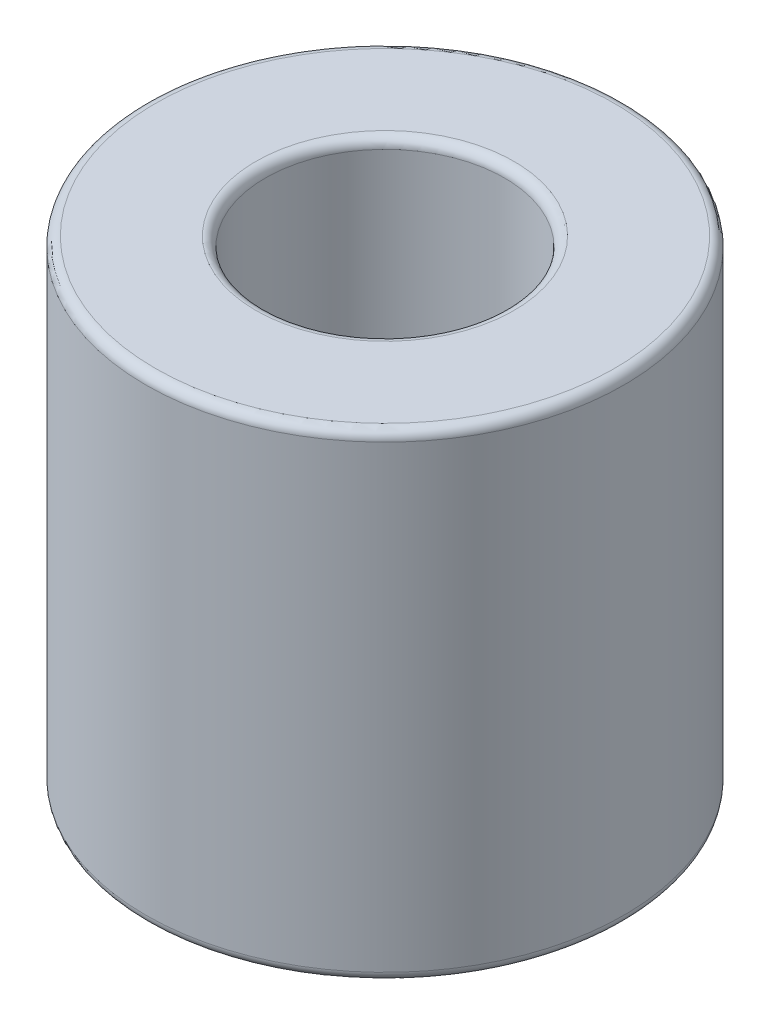
ISO-10303-21;
HEADER;
FILE_DESCRIPTION(('STEP AP214'),'2;1');
FILE_NAME('part.step','',(''),(''),'','','');
FILE_SCHEMA(('AUTOMOTIVE_DESIGN { 1 0 10303 214 1 1 1 1 }'));
ENDSEC;
DATA;
#1=APPLICATION_CONTEXT('core data for automotive mechanical design processes');
#2=APPLICATION_PROTOCOL_DEFINITION('international standard','automotive_design',2000,#1);
#3=PRODUCT_CONTEXT('',#1,'mechanical');
#4=PRODUCT('Part','Part','',(#3));
#5=PRODUCT_RELATED_PRODUCT_CATEGORY('part','',(#4));
#6=PRODUCT_DEFINITION_FORMATION('','',#4);
#7=PRODUCT_DEFINITION_CONTEXT('part definition',#1,'design');
#8=PRODUCT_DEFINITION('design','',#6,#7);
#9=PRODUCT_DEFINITION_SHAPE('','',#8);
#10=(LENGTH_UNIT() NAMED_UNIT(*) SI_UNIT(.MILLI.,.METRE.));
#11=(NAMED_UNIT(*) PLANE_ANGLE_UNIT() SI_UNIT($,.RADIAN.));
#12=(NAMED_UNIT(*) SI_UNIT($,.STERADIAN.) SOLID_ANGLE_UNIT());
#13=UNCERTAINTY_MEASURE_WITH_UNIT(LENGTH_MEASURE(1.E-05),#10,'distance_accuracy_value','');
#14=(GEOMETRIC_REPRESENTATION_CONTEXT(3) GLOBAL_UNCERTAINTY_ASSIGNED_CONTEXT((#13)) GLOBAL_UNIT_ASSIGNED_CONTEXT((#10,
#11,#12)) REPRESENTATION_CONTEXT('',''));
#15=CARTESIAN_POINT('',(0.,0.,0.));
#16=DIRECTION('',(0.,0.,1.));
#17=DIRECTION('',(1.,0.,0.));
#18=AXIS2_PLACEMENT_3D('',#15,#16,#17);
#19=CARTESIAN_POINT('',(0.,6.35,0.));
#20=DIRECTION('',(0.,-1.,0.));
#21=DIRECTION('',(0.,0.,-1.));
#22=AXIS2_PLACEMENT_3D('',#19,#20,#21);
#23=CYLINDRICAL_SURFACE('',#22,3.175);
#24=CARTESIAN_POINT('',(0.,0.127,0.));
#25=DIRECTION('',(0.,1.,0.));
#26=DIRECTION('',(0.,0.,1.));
#27=AXIS2_PLACEMENT_3D('',#24,#25,#26);
#28=CIRCLE('',#27,3.175);
#29=CARTESIAN_POINT('',(0.,0.127,3.175));
#30=VERTEX_POINT('',#29);
#31=EDGE_CURVE('E44',#30,#30,#28,.T.);
#32=ORIENTED_EDGE('',*,*,#31,.T.);
#33=EDGE_LOOP('',(#32));
#34=FACE_BOUND('',#33,.T.);
#35=CARTESIAN_POINT('',(0.,6.223,0.));
#36=DIRECTION('',(0.,1.,0.));
#37=DIRECTION('',(0.,0.,1.));
#38=AXIS2_PLACEMENT_3D('',#35,#36,#37);
#39=CIRCLE('',#38,3.175);
#40=CARTESIAN_POINT('',(0.,6.223,3.175));
#41=VERTEX_POINT('',#40);
#42=EDGE_CURVE('E48',#41,#41,#39,.F.);
#43=ORIENTED_EDGE('',*,*,#42,.T.);
#44=EDGE_LOOP('',(#43));
#45=FACE_BOUND('',#44,.T.);
#46=ADVANCED_FACE('F33',(#34,#45),#23,.T.);
#47=CARTESIAN_POINT('',(0.,6.35,0.));
#48=DIRECTION('',(0.,1.,0.));
#49=DIRECTION('',(0.,0.,1.));
#50=AXIS2_PLACEMENT_3D('',#47,#48,#49);
#51=PLANE('',#50);
#52=CARTESIAN_POINT('',(0.,6.35,0.));
#53=DIRECTION('',(0.,1.,0.));
#54=DIRECTION('',(0.,0.,1.));
#55=AXIS2_PLACEMENT_3D('',#52,#53,#54);
#56=CIRCLE('',#55,1.7145);
#57=CARTESIAN_POINT('',(0.,6.35,1.7145));
#58=VERTEX_POINT('',#57);
#59=EDGE_CURVE('E10',#58,#58,#56,.F.);
#60=ORIENTED_EDGE('',*,*,#59,.T.);
#61=EDGE_LOOP('',(#60));
#62=FACE_BOUND('',#61,.T.);
#63=CARTESIAN_POINT('',(0.,6.35,0.));
#64=DIRECTION('',(0.,1.,0.));
#65=DIRECTION('',(0.,0.,1.));
#66=AXIS2_PLACEMENT_3D('',#63,#64,#65);
#67=CIRCLE('',#66,3.048);
#68=CARTESIAN_POINT('',(0.,6.35,3.048));
#69=VERTEX_POINT('',#68);
#70=EDGE_CURVE('E40',#69,#69,#67,.T.);
#71=ORIENTED_EDGE('',*,*,#70,.T.);
#72=EDGE_LOOP('',(#71));
#73=FACE_BOUND('',#72,.T.);
#74=ADVANCED_FACE('F78',(#62,#73),#51,.T.);
#75=CARTESIAN_POINT('',(0.,0.,0.));
#76=DIRECTION('',(0.,1.,0.));
#77=DIRECTION('',(0.,0.,1.));
#78=AXIS2_PLACEMENT_3D('',#75,#76,#77);
#79=PLANE('',#78);
#80=CARTESIAN_POINT('',(0.,0.,0.));
#81=DIRECTION('',(0.,1.,0.));
#82=DIRECTION('',(0.,0.,1.));
#83=AXIS2_PLACEMENT_3D('',#80,#81,#82);
#84=CIRCLE('',#83,1.7145);
#85=CARTESIAN_POINT('',(0.,0.,1.7145));
#86=VERTEX_POINT('',#85);
#87=EDGE_CURVE('E59',#86,#86,#84,.T.);
#88=ORIENTED_EDGE('',*,*,#87,.T.);
#89=EDGE_LOOP('',(#88));
#90=FACE_BOUND('',#89,.T.);
#91=CARTESIAN_POINT('',(0.,0.,0.));
#92=DIRECTION('',(0.,1.,0.));
#93=DIRECTION('',(0.,0.,1.));
#94=AXIS2_PLACEMENT_3D('',#91,#92,#93);
#95=CIRCLE('',#94,3.048);
#96=CARTESIAN_POINT('',(0.,0.,3.048));
#97=VERTEX_POINT('',#96);
#98=EDGE_CURVE('E62',#97,#97,#95,.F.);
#99=ORIENTED_EDGE('',*,*,#98,.T.);
#100=EDGE_LOOP('',(#99));
#101=FACE_BOUND('',#100,.T.);
#102=ADVANCED_FACE('F66',(#90,#101),#79,.F.);
#103=CARTESIAN_POINT('',(0.,0.,0.));
#104=DIRECTION('',(0.,1.,0.));
#105=DIRECTION('',(0.,0.,1.));
#106=AXIS2_PLACEMENT_3D('',#103,#104,#105);
#107=CYLINDRICAL_SURFACE('',#106,1.5875);
#108=CARTESIAN_POINT('',(0.,0.127,0.));
#109=DIRECTION('',(0.,1.,0.));
#110=DIRECTION('',(0.,0.,1.));
#111=AXIS2_PLACEMENT_3D('',#108,#109,#110);
#112=CIRCLE('',#111,1.5875);
#113=CARTESIAN_POINT('',(0.,0.127,1.5875));
#114=VERTEX_POINT('',#113);
#115=EDGE_CURVE('E53',#114,#114,#112,.F.);
#116=ORIENTED_EDGE('',*,*,#115,.T.);
#117=EDGE_LOOP('',(#116));
#118=FACE_BOUND('',#117,.T.);
#119=CARTESIAN_POINT('',(0.,6.223,0.));
#120=DIRECTION('',(0.,1.,0.));
#121=DIRECTION('',(0.,0.,1.));
#122=AXIS2_PLACEMENT_3D('',#119,#120,#121);
#123=CIRCLE('',#122,1.5875);
#124=CARTESIAN_POINT('',(0.,6.223,1.5875));
#125=VERTEX_POINT('',#124);
#126=EDGE_CURVE('E56',#125,#125,#123,.T.);
#127=ORIENTED_EDGE('',*,*,#126,.T.);
#128=EDGE_LOOP('',(#127));
#129=FACE_BOUND('',#128,.T.);
#130=ADVANCED_FACE('F93',(#118,#129),#107,.F.);
#131=CARTESIAN_POINT('',(0.,0.127,0.));
#132=DIRECTION('',(0.,1.,0.));
#133=DIRECTION('',(0.,0.,1.));
#134=AXIS2_PLACEMENT_3D('',#131,#132,#133);
#135=TOROIDAL_SURFACE('',#134,1.7145,0.127);
#136=ORIENTED_EDGE('',*,*,#115,.F.);
#137=EDGE_LOOP('',(#136));
#138=FACE_BOUND('',#137,.T.);
#139=ORIENTED_EDGE('',*,*,#87,.F.);
#140=EDGE_LOOP('',(#139));
#141=FACE_BOUND('',#140,.T.);
#142=ADVANCED_FACE('F72',(#138,#141),#135,.T.);
#143=CARTESIAN_POINT('',(0.,0.127,0.));
#144=DIRECTION('',(0.,1.,0.));
#145=DIRECTION('',(0.,0.,1.));
#146=AXIS2_PLACEMENT_3D('',#143,#144,#145);
#147=TOROIDAL_SURFACE('',#146,3.048,0.127);
#148=ORIENTED_EDGE('',*,*,#98,.F.);
#149=EDGE_LOOP('',(#148));
#150=FACE_BOUND('',#149,.T.);
#151=ORIENTED_EDGE('',*,*,#31,.F.);
#152=EDGE_LOOP('',(#151));
#153=FACE_BOUND('',#152,.T.);
#154=ADVANCED_FACE('F68',(#150,#153),#147,.T.);
#155=CARTESIAN_POINT('',(0.,6.223,0.));
#156=DIRECTION('',(0.,1.,0.));
#157=DIRECTION('',(0.,0.,1.));
#158=AXIS2_PLACEMENT_3D('',#155,#156,#157);
#159=TOROIDAL_SURFACE('',#158,1.7145,0.127);
#160=ORIENTED_EDGE('',*,*,#59,.F.);
#161=EDGE_LOOP('',(#160));
#162=FACE_BOUND('',#161,.T.);
#163=ORIENTED_EDGE('',*,*,#126,.F.);
#164=EDGE_LOOP('',(#163));
#165=FACE_BOUND('',#164,.T.);
#166=ADVANCED_FACE('F71',(#162,#165),#159,.T.);
#167=CARTESIAN_POINT('',(0.,6.223,0.));
#168=DIRECTION('',(0.,1.,0.));
#169=DIRECTION('',(0.,0.,1.));
#170=AXIS2_PLACEMENT_3D('',#167,#168,#169);
#171=TOROIDAL_SURFACE('',#170,3.048,0.127);
#172=ORIENTED_EDGE('',*,*,#42,.F.);
#173=EDGE_LOOP('',(#172));
#174=FACE_BOUND('',#173,.T.);
#175=ORIENTED_EDGE('',*,*,#70,.F.);
#176=EDGE_LOOP('',(#175));
#177=FACE_BOUND('',#176,.T.);
#178=ADVANCED_FACE('F35',(#174,#177),#171,.T.);
#179=CLOSED_SHELL('',(#46,#74,#102,#130,#142,#154,#166,#178));
#180=MANIFOLD_SOLID_BREP('B2',#179);
#181=ADVANCED_BREP_SHAPE_REPRESENTATION('',(#18,#180),#14);
#182=SHAPE_DEFINITION_REPRESENTATION(#9,#181);
ENDSEC;
END-ISO-10303-21;
